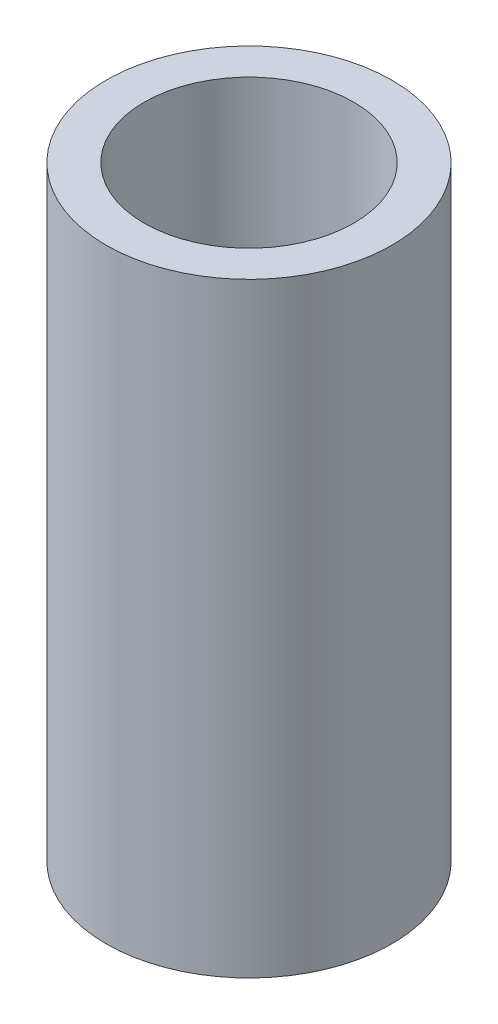
ISO-10303-21;
HEADER;
FILE_DESCRIPTION(('STEP AP214'),'2;1');
FILE_NAME('part.step','',(''),(''),'','','');
FILE_SCHEMA(('AUTOMOTIVE_DESIGN { 1 0 10303 214 1 1 1 1 }'));
ENDSEC;
DATA;
#1=APPLICATION_CONTEXT('core data for automotive mechanical design processes');
#2=APPLICATION_PROTOCOL_DEFINITION('international standard','automotive_design',2000,#1);
#3=PRODUCT_CONTEXT('',#1,'mechanical');
#4=PRODUCT('Part','Part','',(#3));
#5=PRODUCT_RELATED_PRODUCT_CATEGORY('part','',(#4));
#6=PRODUCT_DEFINITION_FORMATION('','',#4);
#7=PRODUCT_DEFINITION_CONTEXT('part definition',#1,'design');
#8=PRODUCT_DEFINITION('design','',#6,#7);
#9=PRODUCT_DEFINITION_SHAPE('','',#8);
#10=(LENGTH_UNIT() NAMED_UNIT(*) SI_UNIT(.MILLI.,.METRE.));
#11=(NAMED_UNIT(*) PLANE_ANGLE_UNIT() SI_UNIT($,.RADIAN.));
#12=(NAMED_UNIT(*) SI_UNIT($,.STERADIAN.) SOLID_ANGLE_UNIT());
#13=UNCERTAINTY_MEASURE_WITH_UNIT(LENGTH_MEASURE(1.E-05),#10,'distance_accuracy_value','');
#14=(GEOMETRIC_REPRESENTATION_CONTEXT(3) GLOBAL_UNCERTAINTY_ASSIGNED_CONTEXT((#13)) GLOBAL_UNIT_ASSIGNED_CONTEXT((#10,
#11,#12)) REPRESENTATION_CONTEXT('',''));
#15=CARTESIAN_POINT('',(0.,0.,0.));
#16=DIRECTION('',(0.,0.,1.));
#17=DIRECTION('',(1.,0.,0.));
#18=AXIS2_PLACEMENT_3D('',#15,#16,#17);
#19=CARTESIAN_POINT('',(-31.15160238925,12.8973975542718,-24.0540477693363));
#20=DIRECTION('',(0.,-1.,0.));
#21=DIRECTION('',(0.,0.,-1.));
#22=AXIS2_PLACEMENT_3D('',#19,#20,#21);
#23=CYLINDRICAL_SURFACE('',#22,1.5);
#24=CARTESIAN_POINT('',(-31.15160238925,12.8973975542718,-24.0540477693363));
#25=DIRECTION('',(0.,1.,0.));
#26=DIRECTION('',(0.,0.,1.));
#27=AXIS2_PLACEMENT_3D('',#24,#25,#26);
#28=CIRCLE('',#27,1.5);
#29=CARTESIAN_POINT('',(-31.15160238925,12.8973975542718,-22.5540477693363));
#30=VERTEX_POINT('',#29);
#31=EDGE_CURVE('E10',#30,#30,#28,.T.);
#32=ORIENTED_EDGE('',*,*,#31,.F.);
#33=EDGE_LOOP('',(#32));
#34=FACE_BOUND('',#33,.T.);
#35=CARTESIAN_POINT('',(-31.15160238925,6.54739755427182,-24.0540477693363));
#36=DIRECTION('',(0.,1.,0.));
#37=DIRECTION('',(0.,0.,1.));
#38=AXIS2_PLACEMENT_3D('',#35,#36,#37);
#39=CIRCLE('',#38,1.5);
#40=CARTESIAN_POINT('',(-31.15160238925,6.54739755427182,-22.5540477693363));
#41=VERTEX_POINT('',#40);
#42=EDGE_CURVE('E34',#41,#41,#39,.T.);
#43=ORIENTED_EDGE('',*,*,#42,.T.);
#44=EDGE_LOOP('',(#43));
#45=FACE_BOUND('',#44,.T.);
#46=ADVANCED_FACE('F31',(#34,#45),#23,.T.);
#47=CARTESIAN_POINT('',(-31.15160238925,12.8973975542718,-24.0540477693363));
#48=DIRECTION('',(0.,1.,0.));
#49=DIRECTION('',(0.,0.,1.));
#50=AXIS2_PLACEMENT_3D('',#47,#48,#49);
#51=PLANE('',#50);
#52=CARTESIAN_POINT('',(-31.15160238925,12.8973975542718,-24.0540477693363));
#53=DIRECTION('',(0.,-1.,0.));
#54=DIRECTION('',(0.,0.,-1.));
#55=AXIS2_PLACEMENT_3D('',#52,#53,#54);
#56=CIRCLE('',#55,1.10000000000001);
#57=CARTESIAN_POINT('',(-31.15160238925,12.8973975542718,-25.1540477693363));
#58=VERTEX_POINT('',#57);
#59=EDGE_CURVE('E41',#58,#58,#56,.T.);
#60=ORIENTED_EDGE('',*,*,#59,.T.);
#61=EDGE_LOOP('',(#60));
#62=FACE_BOUND('',#61,.T.);
#63=ORIENTED_EDGE('',*,*,#31,.T.);
#64=EDGE_LOOP('',(#63));
#65=FACE_BOUND('',#64,.T.);
#66=ADVANCED_FACE('F49',(#62,#65),#51,.T.);
#67=CARTESIAN_POINT('',(-31.15160238925,6.54739755427182,-24.0540477693363));
#68=DIRECTION('',(0.,1.,0.));
#69=DIRECTION('',(0.,0.,1.));
#70=AXIS2_PLACEMENT_3D('',#67,#68,#69);
#71=PLANE('',#70);
#72=CARTESIAN_POINT('',(-31.15160238925,6.54739755427182,-24.0540477693363));
#73=DIRECTION('',(0.,-1.,0.));
#74=DIRECTION('',(0.,0.,-1.));
#75=AXIS2_PLACEMENT_3D('',#72,#73,#74);
#76=CIRCLE('',#75,1.10000000000001);
#77=CARTESIAN_POINT('',(-31.15160238925,6.54739755427182,-25.1540477693363));
#78=VERTEX_POINT('',#77);
#79=EDGE_CURVE('E43',#78,#78,#76,.T.);
#80=ORIENTED_EDGE('',*,*,#79,.F.);
#81=EDGE_LOOP('',(#80));
#82=FACE_BOUND('',#81,.T.);
#83=ORIENTED_EDGE('',*,*,#42,.F.);
#84=EDGE_LOOP('',(#83));
#85=FACE_BOUND('',#84,.T.);
#86=ADVANCED_FACE('F54',(#82,#85),#71,.F.);
#87=CARTESIAN_POINT('',(-31.15160238925,12.8973975542718,-24.0540477693363));
#88=DIRECTION('',(0.,-1.,0.));
#89=DIRECTION('',(0.,0.,-1.));
#90=AXIS2_PLACEMENT_3D('',#87,#88,#89);
#91=CYLINDRICAL_SURFACE('',#90,1.10000000000001);
#92=ORIENTED_EDGE('',*,*,#59,.F.);
#93=EDGE_LOOP('',(#92));
#94=FACE_BOUND('',#93,.T.);
#95=ORIENTED_EDGE('',*,*,#79,.T.);
#96=EDGE_LOOP('',(#95));
#97=FACE_BOUND('',#96,.T.);
#98=ADVANCED_FACE('F51',(#94,#97),#91,.F.);
#99=CLOSED_SHELL('',(#46,#66,#86,#98));
#100=MANIFOLD_SOLID_BREP('B2',#99);
#101=ADVANCED_BREP_SHAPE_REPRESENTATION('',(#18,#100),#14);
#102=SHAPE_DEFINITION_REPRESENTATION(#9,#101);
ENDSEC;
END-ISO-10303-21;
